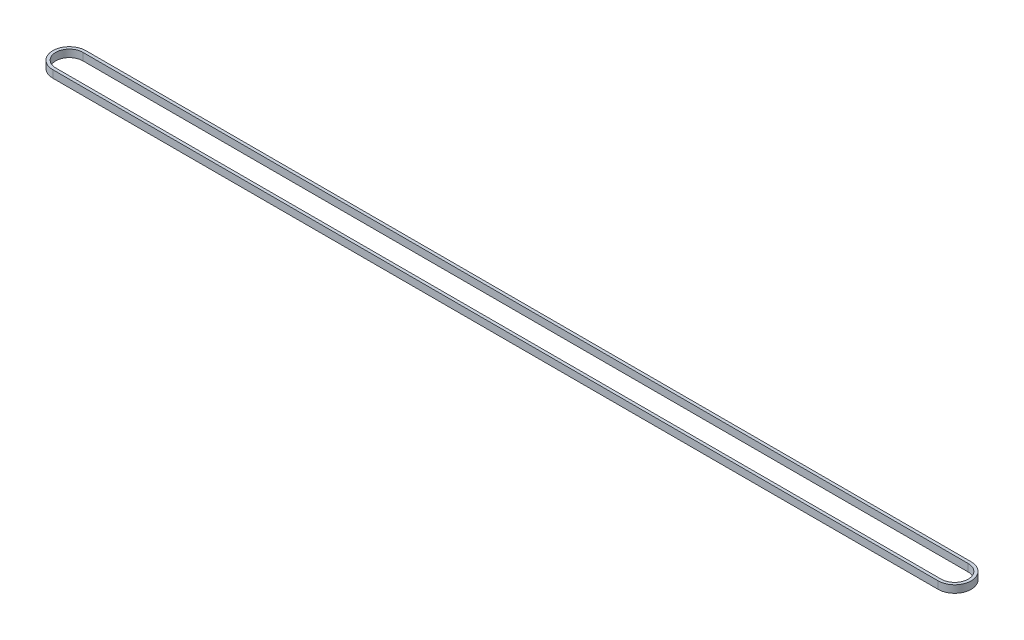
ISO-10303-21;
HEADER;
FILE_DESCRIPTION(('STEP AP214'),'2;1');
FILE_NAME('part.step','',(''),(''),'','','');
FILE_SCHEMA(('AUTOMOTIVE_DESIGN { 1 0 10303 214 1 1 1 1 }'));
ENDSEC;
DATA;
#1=APPLICATION_CONTEXT('core data for automotive mechanical design processes');
#2=APPLICATION_PROTOCOL_DEFINITION('international standard','automotive_design',2000,#1);
#3=PRODUCT_CONTEXT('',#1,'mechanical');
#4=PRODUCT('Part','Part','',(#3));
#5=PRODUCT_RELATED_PRODUCT_CATEGORY('part','',(#4));
#6=PRODUCT_DEFINITION_FORMATION('','',#4);
#7=PRODUCT_DEFINITION_CONTEXT('part definition',#1,'design');
#8=PRODUCT_DEFINITION('design','',#6,#7);
#9=PRODUCT_DEFINITION_SHAPE('','',#8);
#10=(LENGTH_UNIT() NAMED_UNIT(*) SI_UNIT(.MILLI.,.METRE.));
#11=(NAMED_UNIT(*) PLANE_ANGLE_UNIT() SI_UNIT($,.RADIAN.));
#12=(NAMED_UNIT(*) SI_UNIT($,.STERADIAN.) SOLID_ANGLE_UNIT());
#13=UNCERTAINTY_MEASURE_WITH_UNIT(LENGTH_MEASURE(1.E-05),#10,'distance_accuracy_value','');
#14=(GEOMETRIC_REPRESENTATION_CONTEXT(3) GLOBAL_UNCERTAINTY_ASSIGNED_CONTEXT((#13)) GLOBAL_UNIT_ASSIGNED_CONTEXT((#10,
#11,#12)) REPRESENTATION_CONTEXT('',''));
#15=CARTESIAN_POINT('',(0.,0.,0.));
#16=DIRECTION('',(0.,0.,1.));
#17=DIRECTION('',(1.,0.,0.));
#18=AXIS2_PLACEMENT_3D('',#15,#16,#17);
#19=CARTESIAN_POINT('',(-298.855,5.,0.));
#20=DIRECTION('',(0.,1.,0.));
#21=DIRECTION('',(0.,0.,1.));
#22=AXIS2_PLACEMENT_3D('',#19,#20,#21);
#23=PLANE('',#22);
#24=CARTESIAN_POINT('',(-298.855,5.,0.));
#25=DIRECTION('',(0.,1.,0.));
#26=DIRECTION('',(0.,0.,1.));
#27=AXIS2_PLACEMENT_3D('',#24,#25,#26);
#28=CIRCLE('',#27,11.1500000000001);
#29=CARTESIAN_POINT('',(-298.855,5.,-11.1500000000001));
#30=VERTEX_POINT('',#29);
#31=CARTESIAN_POINT('',(-298.855,5.,11.1500000000001));
#32=VERTEX_POINT('',#31);
#33=EDGE_CURVE('E139',#30,#32,#28,.T.);
#34=ORIENTED_EDGE('',*,*,#33,.T.);
#35=DIRECTION('',(1.,0.,0.));
#36=VECTOR('',#35,1.);
#37=CARTESIAN_POINT('',(-298.855,5.,11.1500000000001));
#38=LINE('',#37,#36);
#39=CARTESIAN_POINT('',(298.855,5.,11.1500000000001));
#40=VERTEX_POINT('',#39);
#41=EDGE_CURVE('E142',#32,#40,#38,.T.);
#42=ORIENTED_EDGE('',*,*,#41,.T.);
#43=CARTESIAN_POINT('',(298.855,5.,0.));
#44=DIRECTION('',(0.,1.,0.));
#45=DIRECTION('',(0.,0.,1.));
#46=AXIS2_PLACEMENT_3D('',#43,#44,#45);
#47=CIRCLE('',#46,11.1500000000001);
#48=CARTESIAN_POINT('',(298.855,5.,-11.1500000000003));
#49=VERTEX_POINT('',#48);
#50=EDGE_CURVE('E145',#40,#49,#47,.T.);
#51=ORIENTED_EDGE('',*,*,#50,.T.);
#52=DIRECTION('',(-1.,0.,0.));
#53=VECTOR('',#52,1.);
#54=CARTESIAN_POINT('',(-298.855,5.,-11.1500000000001));
#55=LINE('',#54,#53);
#56=EDGE_CURVE('E147',#49,#30,#55,.T.);
#57=ORIENTED_EDGE('',*,*,#56,.T.);
#58=EDGE_LOOP('',(#34,#42,#51,#57));
#59=FACE_BOUND('',#58,.T.);
#60=DIRECTION('',(-1.,0.,0.));
#61=VECTOR('',#60,1.);
#62=CARTESIAN_POINT('',(298.855,5.,-9.1500000000001));
#63=LINE('',#62,#61);
#64=CARTESIAN_POINT('',(298.855,5.,-9.1500000000001));
#65=VERTEX_POINT('',#64);
#66=CARTESIAN_POINT('',(-298.855,5.,-9.15));
#67=VERTEX_POINT('',#66);
#68=EDGE_CURVE('E111',#65,#67,#63,.T.);
#69=ORIENTED_EDGE('',*,*,#68,.F.);
#70=CARTESIAN_POINT('',(298.855,5.,0.));
#71=DIRECTION('',(0.,1.,0.));
#72=DIRECTION('',(0.,0.,1.));
#73=AXIS2_PLACEMENT_3D('',#70,#71,#72);
#74=CIRCLE('',#73,9.15);
#75=CARTESIAN_POINT('',(298.855,5.,9.14999999999989));
#76=VERTEX_POINT('',#75);
#77=EDGE_CURVE('E103',#76,#65,#74,.T.);
#78=ORIENTED_EDGE('',*,*,#77,.F.);
#79=DIRECTION('',(1.,0.,0.));
#80=VECTOR('',#79,1.);
#81=CARTESIAN_POINT('',(298.855,5.,9.14999999999989));
#82=LINE('',#81,#80);
#83=CARTESIAN_POINT('',(-298.855,5.,9.15000000000007));
#84=VERTEX_POINT('',#83);
#85=EDGE_CURVE('E125',#84,#76,#82,.T.);
#86=ORIENTED_EDGE('',*,*,#85,.F.);
#87=CARTESIAN_POINT('',(-298.855,5.,0.));
#88=DIRECTION('',(0.,1.,0.));
#89=DIRECTION('',(0.,0.,1.));
#90=AXIS2_PLACEMENT_3D('',#87,#88,#89);
#91=CIRCLE('',#90,9.15);
#92=EDGE_CURVE('E123',#67,#84,#91,.T.);
#93=ORIENTED_EDGE('',*,*,#92,.F.);
#94=EDGE_LOOP('',(#69,#78,#86,#93));
#95=FACE_BOUND('',#94,.T.);
#96=ADVANCED_FACE('F38',(#59,#95),#23,.T.);
#97=CARTESIAN_POINT('',(-298.855,0.,0.));
#98=DIRECTION('',(0.,1.,0.));
#99=DIRECTION('',(0.,0.,1.));
#100=AXIS2_PLACEMENT_3D('',#97,#98,#99);
#101=PLANE('',#100);
#102=CARTESIAN_POINT('',(-298.855,0.,0.));
#103=DIRECTION('',(0.,1.,0.));
#104=DIRECTION('',(0.,0.,1.));
#105=AXIS2_PLACEMENT_3D('',#102,#103,#104);
#106=CIRCLE('',#105,11.1500000000001);
#107=CARTESIAN_POINT('',(-298.855,0.,-11.1500000000001));
#108=VERTEX_POINT('',#107);
#109=CARTESIAN_POINT('',(-298.855,0.,11.1500000000001));
#110=VERTEX_POINT('',#109);
#111=EDGE_CURVE('E119',#108,#110,#106,.T.);
#112=ORIENTED_EDGE('',*,*,#111,.F.);
#113=DIRECTION('',(-1.,0.,0.));
#114=VECTOR('',#113,1.);
#115=CARTESIAN_POINT('',(-298.855,0.,-11.1500000000001));
#116=LINE('',#115,#114);
#117=CARTESIAN_POINT('',(298.855,0.,-11.1500000000003));
#118=VERTEX_POINT('',#117);
#119=EDGE_CURVE('E143',#118,#108,#116,.T.);
#120=ORIENTED_EDGE('',*,*,#119,.F.);
#121=CARTESIAN_POINT('',(298.855,0.,0.));
#122=DIRECTION('',(0.,1.,0.));
#123=DIRECTION('',(0.,0.,1.));
#124=AXIS2_PLACEMENT_3D('',#121,#122,#123);
#125=CIRCLE('',#124,11.1500000000001);
#126=CARTESIAN_POINT('',(298.855,0.,11.1500000000001));
#127=VERTEX_POINT('',#126);
#128=EDGE_CURVE('E154',#127,#118,#125,.T.);
#129=ORIENTED_EDGE('',*,*,#128,.F.);
#130=DIRECTION('',(1.,0.,0.));
#131=VECTOR('',#130,1.);
#132=CARTESIAN_POINT('',(-298.855,0.,11.1500000000001));
#133=LINE('',#132,#131);
#134=EDGE_CURVE('E152',#110,#127,#133,.T.);
#135=ORIENTED_EDGE('',*,*,#134,.F.);
#136=EDGE_LOOP('',(#112,#120,#129,#135));
#137=FACE_BOUND('',#136,.T.);
#138=CARTESIAN_POINT('',(298.855,0.,0.));
#139=DIRECTION('',(0.,1.,0.));
#140=DIRECTION('',(0.,0.,1.));
#141=AXIS2_PLACEMENT_3D('',#138,#139,#140);
#142=CIRCLE('',#141,9.15);
#143=CARTESIAN_POINT('',(298.855,0.,9.14999999999989));
#144=VERTEX_POINT('',#143);
#145=CARTESIAN_POINT('',(298.855,0.,-9.1500000000001));
#146=VERTEX_POINT('',#145);
#147=EDGE_CURVE('E61',#144,#146,#142,.T.);
#148=ORIENTED_EDGE('',*,*,#147,.T.);
#149=DIRECTION('',(-1.,0.,0.));
#150=VECTOR('',#149,1.);
#151=CARTESIAN_POINT('',(298.855,0.,-9.1500000000001));
#152=LINE('',#151,#150);
#153=CARTESIAN_POINT('',(-298.855,0.,-9.15));
#154=VERTEX_POINT('',#153);
#155=EDGE_CURVE('E118',#146,#154,#152,.T.);
#156=ORIENTED_EDGE('',*,*,#155,.T.);
#157=CARTESIAN_POINT('',(-298.855,0.,0.));
#158=DIRECTION('',(0.,1.,0.));
#159=DIRECTION('',(0.,0.,1.));
#160=AXIS2_PLACEMENT_3D('',#157,#158,#159);
#161=CIRCLE('',#160,9.15);
#162=CARTESIAN_POINT('',(-298.855,0.,9.15000000000007));
#163=VERTEX_POINT('',#162);
#164=EDGE_CURVE('E131',#154,#163,#161,.T.);
#165=ORIENTED_EDGE('',*,*,#164,.T.);
#166=DIRECTION('',(1.,0.,0.));
#167=VECTOR('',#166,1.);
#168=CARTESIAN_POINT('',(298.855,0.,9.14999999999989));
#169=LINE('',#168,#167);
#170=EDGE_CURVE('E112',#163,#144,#169,.T.);
#171=ORIENTED_EDGE('',*,*,#170,.T.);
#172=EDGE_LOOP('',(#148,#156,#165,#171));
#173=FACE_BOUND('',#172,.T.);
#174=ADVANCED_FACE('F172',(#137,#173),#101,.F.);
#175=CARTESIAN_POINT('',(-298.855,5.,0.));
#176=DIRECTION('',(0.,-1.,0.));
#177=DIRECTION('',(0.,0.,-1.));
#178=AXIS2_PLACEMENT_3D('',#175,#176,#177);
#179=CYLINDRICAL_SURFACE('',#178,11.1500000000001);
#180=ORIENTED_EDGE('',*,*,#111,.T.);
#181=DIRECTION('',(0.,-1.,0.));
#182=VECTOR('',#181,1.);
#183=CARTESIAN_POINT('',(-298.855,5.,11.1500000000001));
#184=LINE('',#183,#182);
#185=EDGE_CURVE('E11',#32,#110,#184,.T.);
#186=ORIENTED_EDGE('',*,*,#185,.F.);
#187=ORIENTED_EDGE('',*,*,#33,.F.);
#188=DIRECTION('',(0.,-1.,0.));
#189=VECTOR('',#188,1.);
#190=CARTESIAN_POINT('',(-298.855,5.,-11.1500000000001));
#191=LINE('',#190,#189);
#192=EDGE_CURVE('E149',#30,#108,#191,.T.);
#193=ORIENTED_EDGE('',*,*,#192,.T.);
#194=EDGE_LOOP('',(#180,#186,#187,#193));
#195=FACE_BOUND('',#194,.T.);
#196=ADVANCED_FACE('F40',(#195),#179,.T.);
#197=CARTESIAN_POINT('',(-298.855,5.,11.1500000000001));
#198=DIRECTION('',(0.,0.,-1.));
#199=DIRECTION('',(-1.,0.,0.));
#200=AXIS2_PLACEMENT_3D('',#197,#198,#199);
#201=PLANE('',#200);
#202=ORIENTED_EDGE('',*,*,#134,.T.);
#203=DIRECTION('',(0.,-1.,0.));
#204=VECTOR('',#203,1.);
#205=CARTESIAN_POINT('',(298.855,5.,11.1500000000001));
#206=LINE('',#205,#204);
#207=EDGE_CURVE('E46',#40,#127,#206,.T.);
#208=ORIENTED_EDGE('',*,*,#207,.F.);
#209=ORIENTED_EDGE('',*,*,#41,.F.);
#210=ORIENTED_EDGE('',*,*,#185,.T.);
#211=EDGE_LOOP('',(#202,#208,#209,#210));
#212=FACE_BOUND('',#211,.T.);
#213=ADVANCED_FACE('F182',(#212),#201,.F.);
#214=CARTESIAN_POINT('',(298.855,5.,0.));
#215=DIRECTION('',(0.,-1.,0.));
#216=DIRECTION('',(0.,0.,-1.));
#217=AXIS2_PLACEMENT_3D('',#214,#215,#216);
#218=CYLINDRICAL_SURFACE('',#217,11.1500000000001);
#219=ORIENTED_EDGE('',*,*,#128,.T.);
#220=DIRECTION('',(0.,-1.,0.));
#221=VECTOR('',#220,1.);
#222=CARTESIAN_POINT('',(298.855,5.,-11.1500000000003));
#223=LINE('',#222,#221);
#224=EDGE_CURVE('E159',#49,#118,#223,.T.);
#225=ORIENTED_EDGE('',*,*,#224,.F.);
#226=ORIENTED_EDGE('',*,*,#50,.F.);
#227=ORIENTED_EDGE('',*,*,#207,.T.);
#228=EDGE_LOOP('',(#219,#225,#226,#227));
#229=FACE_BOUND('',#228,.T.);
#230=ADVANCED_FACE('F166',(#229),#218,.T.);
#231=CARTESIAN_POINT('',(-298.855,5.,-11.1500000000001));
#232=DIRECTION('',(0.,0.,1.));
#233=DIRECTION('',(1.,0.,0.));
#234=AXIS2_PLACEMENT_3D('',#231,#232,#233);
#235=PLANE('',#234);
#236=ORIENTED_EDGE('',*,*,#119,.T.);
#237=ORIENTED_EDGE('',*,*,#192,.F.);
#238=ORIENTED_EDGE('',*,*,#56,.F.);
#239=ORIENTED_EDGE('',*,*,#224,.T.);
#240=EDGE_LOOP('',(#236,#237,#238,#239));
#241=FACE_BOUND('',#240,.T.);
#242=ADVANCED_FACE('F176',(#241),#235,.F.);
#243=CARTESIAN_POINT('',(298.855,5.,0.));
#244=DIRECTION('',(0.,-1.,0.));
#245=DIRECTION('',(0.,0.,-1.));
#246=AXIS2_PLACEMENT_3D('',#243,#244,#245);
#247=CYLINDRICAL_SURFACE('',#246,9.15);
#248=ORIENTED_EDGE('',*,*,#147,.F.);
#249=DIRECTION('',(0.,-1.,0.));
#250=VECTOR('',#249,1.);
#251=CARTESIAN_POINT('',(298.855,5.,9.14999999999989));
#252=LINE('',#251,#250);
#253=EDGE_CURVE('E107',#76,#144,#252,.T.);
#254=ORIENTED_EDGE('',*,*,#253,.F.);
#255=ORIENTED_EDGE('',*,*,#77,.T.);
#256=DIRECTION('',(0.,-1.,0.));
#257=VECTOR('',#256,1.);
#258=CARTESIAN_POINT('',(298.855,5.,-9.1500000000001));
#259=LINE('',#258,#257);
#260=EDGE_CURVE('E106',#65,#146,#259,.T.);
#261=ORIENTED_EDGE('',*,*,#260,.T.);
#262=EDGE_LOOP('',(#248,#254,#255,#261));
#263=FACE_BOUND('',#262,.T.);
#264=ADVANCED_FACE('F105',(#263),#247,.F.);
#265=CARTESIAN_POINT('',(298.855,5.,-9.1500000000001));
#266=DIRECTION('',(0.,0.,1.));
#267=DIRECTION('',(1.,0.,0.));
#268=AXIS2_PLACEMENT_3D('',#265,#266,#267);
#269=PLANE('',#268);
#270=ORIENTED_EDGE('',*,*,#155,.F.);
#271=ORIENTED_EDGE('',*,*,#260,.F.);
#272=ORIENTED_EDGE('',*,*,#68,.T.);
#273=DIRECTION('',(0.,-1.,0.));
#274=VECTOR('',#273,1.);
#275=CARTESIAN_POINT('',(-298.855,5.,-9.15));
#276=LINE('',#275,#274);
#277=EDGE_CURVE('E120',#67,#154,#276,.T.);
#278=ORIENTED_EDGE('',*,*,#277,.T.);
#279=EDGE_LOOP('',(#270,#271,#272,#278));
#280=FACE_BOUND('',#279,.T.);
#281=ADVANCED_FACE('F115',(#280),#269,.T.);
#282=CARTESIAN_POINT('',(-298.855,5.,0.));
#283=DIRECTION('',(0.,-1.,0.));
#284=DIRECTION('',(0.,0.,-1.));
#285=AXIS2_PLACEMENT_3D('',#282,#283,#284);
#286=CYLINDRICAL_SURFACE('',#285,9.15);
#287=ORIENTED_EDGE('',*,*,#164,.F.);
#288=ORIENTED_EDGE('',*,*,#277,.F.);
#289=ORIENTED_EDGE('',*,*,#92,.T.);
#290=DIRECTION('',(0.,-1.,0.));
#291=VECTOR('',#290,1.);
#292=CARTESIAN_POINT('',(-298.855,5.,9.15000000000007));
#293=LINE('',#292,#291);
#294=EDGE_CURVE('E53',#84,#163,#293,.T.);
#295=ORIENTED_EDGE('',*,*,#294,.T.);
#296=EDGE_LOOP('',(#287,#288,#289,#295));
#297=FACE_BOUND('',#296,.T.);
#298=ADVANCED_FACE('F205',(#297),#286,.F.);
#299=CARTESIAN_POINT('',(298.855,5.,9.14999999999989));
#300=DIRECTION('',(0.,0.,-1.));
#301=DIRECTION('',(-1.,0.,0.));
#302=AXIS2_PLACEMENT_3D('',#299,#300,#301);
#303=PLANE('',#302);
#304=ORIENTED_EDGE('',*,*,#170,.F.);
#305=ORIENTED_EDGE('',*,*,#294,.F.);
#306=ORIENTED_EDGE('',*,*,#85,.T.);
#307=ORIENTED_EDGE('',*,*,#253,.T.);
#308=EDGE_LOOP('',(#304,#305,#306,#307));
#309=FACE_BOUND('',#308,.T.);
#310=ADVANCED_FACE('F209',(#309),#303,.T.);
#311=CLOSED_SHELL('',(#96,#174,#196,#213,#230,#242,#264,#281,#298,#310));
#312=MANIFOLD_SOLID_BREP('B2',#311);
#313=ADVANCED_BREP_SHAPE_REPRESENTATION('',(#18,#312),#14);
#314=SHAPE_DEFINITION_REPRESENTATION(#9,#313);
ENDSEC;
END-ISO-10303-21;
